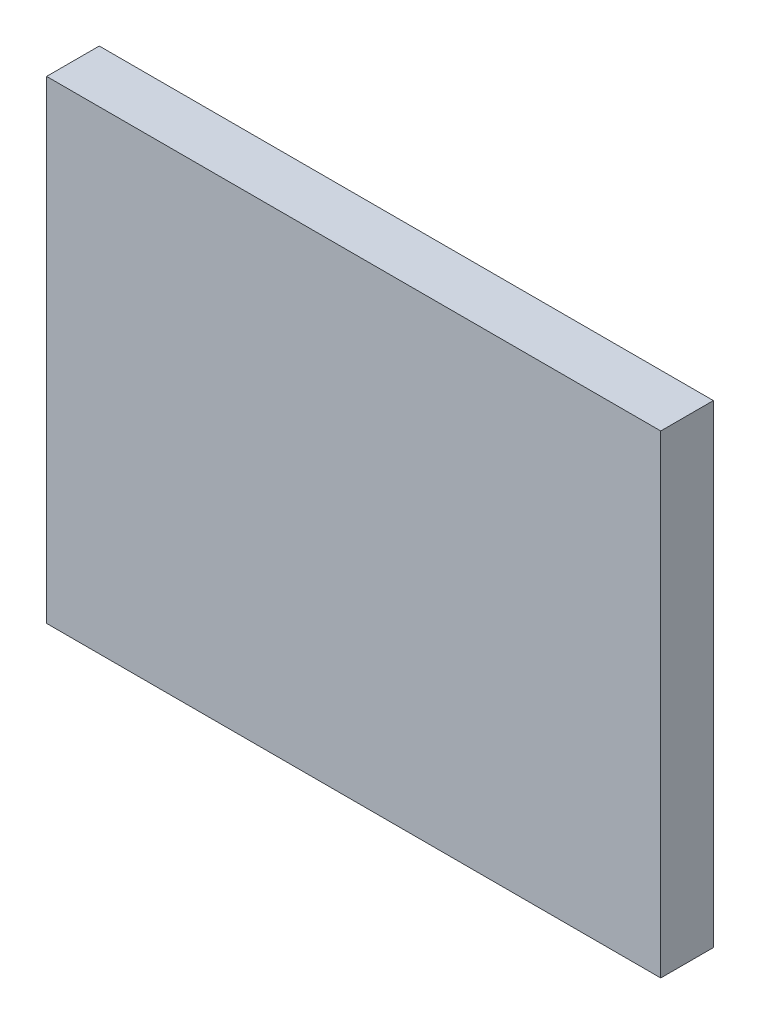
ISO-10303-21;
HEADER;
FILE_DESCRIPTION(('STEP AP214'),'2;1');
FILE_NAME('part.step','',(''),(''),'','','');
FILE_SCHEMA(('AUTOMOTIVE_DESIGN { 1 0 10303 214 1 1 1 1 }'));
ENDSEC;
DATA;
#1=APPLICATION_CONTEXT('core data for automotive mechanical design processes');
#2=APPLICATION_PROTOCOL_DEFINITION('international standard','automotive_design',2000,#1);
#3=PRODUCT_CONTEXT('',#1,'mechanical');
#4=PRODUCT('Part','Part','',(#3));
#5=PRODUCT_RELATED_PRODUCT_CATEGORY('part','',(#4));
#6=PRODUCT_DEFINITION_FORMATION('','',#4);
#7=PRODUCT_DEFINITION_CONTEXT('part definition',#1,'design');
#8=PRODUCT_DEFINITION('design','',#6,#7);
#9=PRODUCT_DEFINITION_SHAPE('','',#8);
#10=(LENGTH_UNIT() NAMED_UNIT(*) SI_UNIT(.MILLI.,.METRE.));
#11=(NAMED_UNIT(*) PLANE_ANGLE_UNIT() SI_UNIT($,.RADIAN.));
#12=(NAMED_UNIT(*) SI_UNIT($,.STERADIAN.) SOLID_ANGLE_UNIT());
#13=UNCERTAINTY_MEASURE_WITH_UNIT(LENGTH_MEASURE(1.E-05),#10,'distance_accuracy_value','');
#14=(GEOMETRIC_REPRESENTATION_CONTEXT(3) GLOBAL_UNCERTAINTY_ASSIGNED_CONTEXT((#13)) GLOBAL_UNIT_ASSIGNED_CONTEXT((#10,
#11,#12)) REPRESENTATION_CONTEXT('',''));
#15=CARTESIAN_POINT('',(0.,0.,0.));
#16=DIRECTION('',(0.,0.,1.));
#17=DIRECTION('',(1.,0.,0.));
#18=AXIS2_PLACEMENT_3D('',#15,#16,#17);
#19=CARTESIAN_POINT('',(-17.5,13.5,3.));
#20=DIRECTION('',(1.,0.,0.));
#21=DIRECTION('',(0.,1.,0.));
#22=AXIS2_PLACEMENT_3D('',#19,#20,#21);
#23=PLANE('',#22);
#24=DIRECTION('',(0.,-1.,0.));
#25=VECTOR('',#24,1.);
#26=CARTESIAN_POINT('',(-17.5,13.5,0.));
#27=LINE('',#26,#25);
#28=CARTESIAN_POINT('',(-17.5,13.5,0.));
#29=VERTEX_POINT('',#28);
#30=CARTESIAN_POINT('',(-17.5,-13.5,0.));
#31=VERTEX_POINT('',#30);
#32=EDGE_CURVE('E96',#29,#31,#27,.T.);
#33=ORIENTED_EDGE('',*,*,#32,.T.);
#34=DIRECTION('',(0.,0.,-1.));
#35=VECTOR('',#34,1.);
#36=CARTESIAN_POINT('',(-17.5,-13.5,3.));
#37=LINE('',#36,#35);
#38=CARTESIAN_POINT('',(-17.5,-13.5,3.));
#39=VERTEX_POINT('',#38);
#40=EDGE_CURVE('E11',#39,#31,#37,.T.);
#41=ORIENTED_EDGE('',*,*,#40,.F.);
#42=DIRECTION('',(0.,-1.,0.));
#43=VECTOR('',#42,1.);
#44=CARTESIAN_POINT('',(-17.5,13.5,3.));
#45=LINE('',#44,#43);
#46=CARTESIAN_POINT('',(-17.5,13.5,3.));
#47=VERTEX_POINT('',#46);
#48=EDGE_CURVE('E84',#47,#39,#45,.T.);
#49=ORIENTED_EDGE('',*,*,#48,.F.);
#50=DIRECTION('',(0.,0.,-1.));
#51=VECTOR('',#50,1.);
#52=CARTESIAN_POINT('',(-17.5,13.5,3.));
#53=LINE('',#52,#51);
#54=EDGE_CURVE('E92',#47,#29,#53,.T.);
#55=ORIENTED_EDGE('',*,*,#54,.T.);
#56=EDGE_LOOP('',(#33,#41,#49,#55));
#57=FACE_BOUND('',#56,.T.);
#58=ADVANCED_FACE('F33',(#57),#23,.F.);
#59=CARTESIAN_POINT('',(-17.5,-13.5,3.));
#60=DIRECTION('',(0.,1.,0.));
#61=DIRECTION('',(0.,0.,1.));
#62=AXIS2_PLACEMENT_3D('',#59,#60,#61);
#63=PLANE('',#62);
#64=DIRECTION('',(1.,0.,0.));
#65=VECTOR('',#64,1.);
#66=CARTESIAN_POINT('',(-17.5,-13.5,0.));
#67=LINE('',#66,#65);
#68=CARTESIAN_POINT('',(17.5,-13.5,0.));
#69=VERTEX_POINT('',#68);
#70=EDGE_CURVE('E88',#31,#69,#67,.T.);
#71=ORIENTED_EDGE('',*,*,#70,.T.);
#72=DIRECTION('',(0.,0.,-1.));
#73=VECTOR('',#72,1.);
#74=CARTESIAN_POINT('',(17.5,-13.5,3.));
#75=LINE('',#74,#73);
#76=CARTESIAN_POINT('',(17.5,-13.5,3.));
#77=VERTEX_POINT('',#76);
#78=EDGE_CURVE('E41',#77,#69,#75,.T.);
#79=ORIENTED_EDGE('',*,*,#78,.F.);
#80=DIRECTION('',(1.,0.,0.));
#81=VECTOR('',#80,1.);
#82=CARTESIAN_POINT('',(-17.5,-13.5,3.));
#83=LINE('',#82,#81);
#84=EDGE_CURVE('E79',#39,#77,#83,.T.);
#85=ORIENTED_EDGE('',*,*,#84,.F.);
#86=ORIENTED_EDGE('',*,*,#40,.T.);
#87=EDGE_LOOP('',(#71,#79,#85,#86));
#88=FACE_BOUND('',#87,.T.);
#89=ADVANCED_FACE('F87',(#88),#63,.F.);
#90=CARTESIAN_POINT('',(17.5,13.5,3.));
#91=DIRECTION('',(-1.,0.,0.));
#92=DIRECTION('',(0.,-1.,0.));
#93=AXIS2_PLACEMENT_3D('',#90,#91,#92);
#94=PLANE('',#93);
#95=DIRECTION('',(0.,1.,0.));
#96=VECTOR('',#95,1.);
#97=CARTESIAN_POINT('',(17.5,13.5,0.));
#98=LINE('',#97,#96);
#99=CARTESIAN_POINT('',(17.5,13.5,0.));
#100=VERTEX_POINT('',#99);
#101=EDGE_CURVE('E66',#69,#100,#98,.T.);
#102=ORIENTED_EDGE('',*,*,#101,.T.);
#103=DIRECTION('',(0.,0.,-1.));
#104=VECTOR('',#103,1.);
#105=CARTESIAN_POINT('',(17.5,13.5,3.));
#106=LINE('',#105,#104);
#107=CARTESIAN_POINT('',(17.5,13.5,3.));
#108=VERTEX_POINT('',#107);
#109=EDGE_CURVE('E89',#108,#100,#106,.T.);
#110=ORIENTED_EDGE('',*,*,#109,.F.);
#111=DIRECTION('',(0.,1.,0.));
#112=VECTOR('',#111,1.);
#113=CARTESIAN_POINT('',(17.5,13.5,3.));
#114=LINE('',#113,#112);
#115=EDGE_CURVE('E82',#77,#108,#114,.T.);
#116=ORIENTED_EDGE('',*,*,#115,.F.);
#117=ORIENTED_EDGE('',*,*,#78,.T.);
#118=EDGE_LOOP('',(#102,#110,#116,#117));
#119=FACE_BOUND('',#118,.T.);
#120=ADVANCED_FACE('F90',(#119),#94,.F.);
#121=CARTESIAN_POINT('',(-17.5,13.5,3.));
#122=DIRECTION('',(0.,-1.,0.));
#123=DIRECTION('',(0.,0.,-1.));
#124=AXIS2_PLACEMENT_3D('',#121,#122,#123);
#125=PLANE('',#124);
#126=DIRECTION('',(-1.,0.,0.));
#127=VECTOR('',#126,1.);
#128=CARTESIAN_POINT('',(-17.5,13.5,0.));
#129=LINE('',#128,#127);
#130=EDGE_CURVE('E72',#100,#29,#129,.T.);
#131=ORIENTED_EDGE('',*,*,#130,.T.);
#132=ORIENTED_EDGE('',*,*,#54,.F.);
#133=DIRECTION('',(-1.,0.,0.));
#134=VECTOR('',#133,1.);
#135=CARTESIAN_POINT('',(-17.5,13.5,3.));
#136=LINE('',#135,#134);
#137=EDGE_CURVE('E49',#108,#47,#136,.T.);
#138=ORIENTED_EDGE('',*,*,#137,.F.);
#139=ORIENTED_EDGE('',*,*,#109,.T.);
#140=EDGE_LOOP('',(#131,#132,#138,#139));
#141=FACE_BOUND('',#140,.T.);
#142=ADVANCED_FACE('F103',(#141),#125,.F.);
#143=CARTESIAN_POINT('',(0.,0.,3.));
#144=DIRECTION('',(0.,0.,1.));
#145=DIRECTION('',(1.,0.,0.));
#146=AXIS2_PLACEMENT_3D('',#143,#144,#145);
#147=PLANE('',#146);
#148=ORIENTED_EDGE('',*,*,#48,.T.);
#149=ORIENTED_EDGE('',*,*,#84,.T.);
#150=ORIENTED_EDGE('',*,*,#115,.T.);
#151=ORIENTED_EDGE('',*,*,#137,.T.);
#152=EDGE_LOOP('',(#148,#149,#150,#151));
#153=FACE_BOUND('',#152,.T.);
#154=ADVANCED_FACE('F80',(#153),#147,.T.);
#155=CARTESIAN_POINT('',(0.,0.,0.));
#156=DIRECTION('',(0.,0.,1.));
#157=DIRECTION('',(1.,0.,0.));
#158=AXIS2_PLACEMENT_3D('',#155,#156,#157);
#159=PLANE('',#158);
#160=ORIENTED_EDGE('',*,*,#32,.F.);
#161=ORIENTED_EDGE('',*,*,#130,.F.);
#162=ORIENTED_EDGE('',*,*,#101,.F.);
#163=ORIENTED_EDGE('',*,*,#70,.F.);
#164=EDGE_LOOP('',(#160,#161,#162,#163));
#165=FACE_BOUND('',#164,.T.);
#166=ADVANCED_FACE('F106',(#165),#159,.F.);
#167=CLOSED_SHELL('',(#58,#89,#120,#142,#154,#166));
#168=MANIFOLD_SOLID_BREP('B2',#167);
#169=ADVANCED_BREP_SHAPE_REPRESENTATION('',(#18,#168),#14);
#170=SHAPE_DEFINITION_REPRESENTATION(#9,#169);
ENDSEC;
END-ISO-10303-21;
